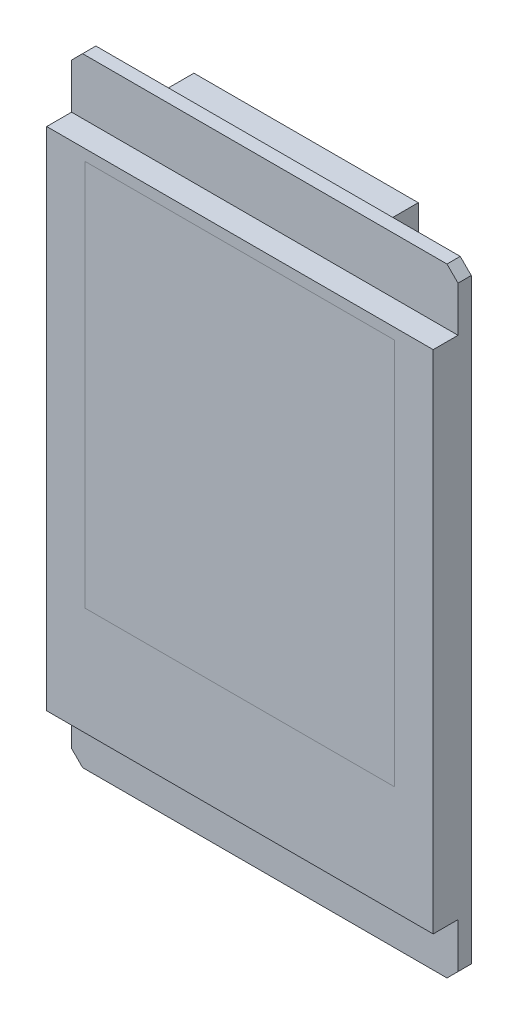
ISO-10303-21;
HEADER;
FILE_DESCRIPTION(('STEP AP214'),'2;1');
FILE_NAME('part.step','',(''),(''),'','','');
FILE_SCHEMA(('AUTOMOTIVE_DESIGN { 1 0 10303 214 1 1 1 1 }'));
ENDSEC;
DATA;
#1=APPLICATION_CONTEXT('core data for automotive mechanical design processes');
#2=APPLICATION_PROTOCOL_DEFINITION('international standard','automotive_design',2000,#1);
#3=PRODUCT_CONTEXT('',#1,'mechanical');
#4=PRODUCT('Part','Part','',(#3));
#5=PRODUCT_RELATED_PRODUCT_CATEGORY('part','',(#4));
#6=PRODUCT_DEFINITION_FORMATION('','',#4);
#7=PRODUCT_DEFINITION_CONTEXT('part definition',#1,'design');
#8=PRODUCT_DEFINITION('design','',#6,#7);
#9=PRODUCT_DEFINITION_SHAPE('','',#8);
#10=(LENGTH_UNIT() NAMED_UNIT(*) SI_UNIT(.MILLI.,.METRE.));
#11=(NAMED_UNIT(*) PLANE_ANGLE_UNIT() SI_UNIT($,.RADIAN.));
#12=(NAMED_UNIT(*) SI_UNIT($,.STERADIAN.) SOLID_ANGLE_UNIT());
#13=UNCERTAINTY_MEASURE_WITH_UNIT(LENGTH_MEASURE(1.E-05),#10,'distance_accuracy_value','');
#14=(GEOMETRIC_REPRESENTATION_CONTEXT(3) GLOBAL_UNCERTAINTY_ASSIGNED_CONTEXT((#13)) GLOBAL_UNIT_ASSIGNED_CONTEXT((#10,
#11,#12)) REPRESENTATION_CONTEXT('',''));
#15=CARTESIAN_POINT('',(0.,0.,0.));
#16=DIRECTION('',(0.,0.,1.));
#17=DIRECTION('',(1.,0.,0.));
#18=AXIS2_PLACEMENT_3D('',#15,#16,#17);
#19=CARTESIAN_POINT('',(0.,0.,0.));
#20=DIRECTION('',(0.,0.,-1.));
#21=DIRECTION('',(-1.,0.,0.));
#22=AXIS2_PLACEMENT_3D('',#19,#20,#21);
#23=PLANE('',#22);
#24=DIRECTION('',(0.,-1.,0.));
#25=VECTOR('',#24,1.);
#26=CARTESIAN_POINT('',(0.,1.,0.));
#27=LINE('',#26,#25);
#28=CARTESIAN_POINT('',(0.,55.,0.));
#29=VERTEX_POINT('',#28);
#30=CARTESIAN_POINT('',(0.,1.,0.));
#31=VERTEX_POINT('',#30);
#32=EDGE_CURVE('E497',#29,#31,#27,.T.);
#33=ORIENTED_EDGE('',*,*,#32,.F.);
#34=DIRECTION('',(-0.707106781186547,-0.707106781186548,0.));
#35=VECTOR('',#34,1.);
#36=CARTESIAN_POINT('',(0.,55.,0.));
#37=LINE('',#36,#35);
#38=CARTESIAN_POINT('',(1.,56.,0.));
#39=VERTEX_POINT('',#38);
#40=EDGE_CURVE('E546',#39,#29,#37,.T.);
#41=ORIENTED_EDGE('',*,*,#40,.F.);
#42=DIRECTION('',(-1.,0.,0.));
#43=VECTOR('',#42,1.);
#44=CARTESIAN_POINT('',(1.,56.,0.));
#45=LINE('',#44,#43);
#46=CARTESIAN_POINT('',(34.,56.,0.));
#47=VERTEX_POINT('',#46);
#48=EDGE_CURVE('E543',#47,#39,#45,.T.);
#49=ORIENTED_EDGE('',*,*,#48,.F.);
#50=DIRECTION('',(-0.707106781186547,0.707106781186547,0.));
#51=VECTOR('',#50,1.);
#52=CARTESIAN_POINT('',(34.,56.,0.));
#53=LINE('',#52,#51);
#54=CARTESIAN_POINT('',(35.,55.,0.));
#55=VERTEX_POINT('',#54);
#56=EDGE_CURVE('E540',#55,#47,#53,.T.);
#57=ORIENTED_EDGE('',*,*,#56,.F.);
#58=DIRECTION('',(0.,1.,0.));
#59=VECTOR('',#58,1.);
#60=CARTESIAN_POINT('',(35.,1.,0.));
#61=LINE('',#60,#59);
#62=CARTESIAN_POINT('',(35.,1.,0.));
#63=VERTEX_POINT('',#62);
#64=EDGE_CURVE('E537',#63,#55,#61,.T.);
#65=ORIENTED_EDGE('',*,*,#64,.F.);
#66=DIRECTION('',(0.707106781186548,0.707106781186547,0.));
#67=VECTOR('',#66,1.);
#68=CARTESIAN_POINT('',(34.,0.,0.));
#69=LINE('',#68,#67);
#70=CARTESIAN_POINT('',(34.,0.,0.));
#71=VERTEX_POINT('',#70);
#72=EDGE_CURVE('E534',#71,#63,#69,.T.);
#73=ORIENTED_EDGE('',*,*,#72,.F.);
#74=DIRECTION('',(1.,0.,0.));
#75=VECTOR('',#74,1.);
#76=CARTESIAN_POINT('',(1.,0.,0.));
#77=LINE('',#76,#75);
#78=CARTESIAN_POINT('',(1.,0.,0.));
#79=VERTEX_POINT('',#78);
#80=EDGE_CURVE('E531',#79,#71,#77,.T.);
#81=ORIENTED_EDGE('',*,*,#80,.F.);
#82=DIRECTION('',(0.707106781186548,-0.707106781186548,0.));
#83=VECTOR('',#82,1.);
#84=CARTESIAN_POINT('',(0.,1.,0.));
#85=LINE('',#84,#83);
#86=EDGE_CURVE('E528',#31,#79,#85,.T.);
#87=ORIENTED_EDGE('',*,*,#86,.F.);
#88=EDGE_LOOP('',(#33,#41,#49,#57,#65,#73,#81,#87));
#89=FACE_BOUND('',#88,.T.);
#90=DIRECTION('',(-1.,0.,0.));
#91=VECTOR('',#90,1.);
#92=CARTESIAN_POINT('',(27.66,53.23,0.));
#93=LINE('',#92,#91);
#94=CARTESIAN_POINT('',(27.66,53.23,0.));
#95=VERTEX_POINT('',#94);
#96=CARTESIAN_POINT('',(7.34,53.23,0.));
#97=VERTEX_POINT('',#96);
#98=EDGE_CURVE('E805',#95,#97,#93,.T.);
#99=ORIENTED_EDGE('',*,*,#98,.F.);
#100=DIRECTION('',(0.,-1.,0.));
#101=VECTOR('',#100,1.);
#102=CARTESIAN_POINT('',(27.66,53.23,0.));
#103=LINE('',#102,#101);
#104=CARTESIAN_POINT('',(27.66,55.77,0.));
#105=VERTEX_POINT('',#104);
#106=EDGE_CURVE('E452',#105,#95,#103,.T.);
#107=ORIENTED_EDGE('',*,*,#106,.F.);
#108=DIRECTION('',(1.,0.,0.));
#109=VECTOR('',#108,1.);
#110=CARTESIAN_POINT('',(27.66,55.77,0.));
#111=LINE('',#110,#109);
#112=CARTESIAN_POINT('',(7.34,55.77,0.));
#113=VERTEX_POINT('',#112);
#114=EDGE_CURVE('E448',#113,#105,#111,.T.);
#115=ORIENTED_EDGE('',*,*,#114,.F.);
#116=DIRECTION('',(0.,1.,0.));
#117=VECTOR('',#116,1.);
#118=CARTESIAN_POINT('',(7.34,53.23,0.));
#119=LINE('',#118,#117);
#120=EDGE_CURVE('E801',#97,#113,#119,.T.);
#121=ORIENTED_EDGE('',*,*,#120,.F.);
#122=EDGE_LOOP('',(#99,#107,#115,#121));
#123=FACE_BOUND('',#122,.T.);
#124=ADVANCED_FACE('F300',(#89,#123),#23,.T.);
#125=CARTESIAN_POINT('',(0.,0.,3.45));
#126=DIRECTION('',(0.,0.,-1.));
#127=DIRECTION('',(-1.,0.,0.));
#128=AXIS2_PLACEMENT_3D('',#125,#126,#127);
#129=PLANE('',#128);
#130=DIRECTION('',(0.,-1.,0.));
#131=VECTOR('',#130,1.);
#132=CARTESIAN_POINT('',(0.,5.08000000000001,3.45));
#133=LINE('',#132,#131);
#134=CARTESIAN_POINT('',(0.,50.91,3.45));
#135=VERTEX_POINT('',#134);
#136=CARTESIAN_POINT('',(0.,5.08000000000001,3.45));
#137=VERTEX_POINT('',#136);
#138=EDGE_CURVE('E465',#135,#137,#133,.T.);
#139=ORIENTED_EDGE('',*,*,#138,.T.);
#140=DIRECTION('',(1.,0.,0.));
#141=VECTOR('',#140,1.);
#142=CARTESIAN_POINT('',(0.,5.08000000000001,3.45));
#143=LINE('',#142,#141);
#144=CARTESIAN_POINT('',(35.,5.08000000000001,3.45));
#145=VERTEX_POINT('',#144);
#146=EDGE_CURVE('E469',#137,#145,#143,.T.);
#147=ORIENTED_EDGE('',*,*,#146,.T.);
#148=DIRECTION('',(0.,1.,0.));
#149=VECTOR('',#148,1.);
#150=CARTESIAN_POINT('',(35.,5.08000000000001,3.45));
#151=LINE('',#150,#149);
#152=CARTESIAN_POINT('',(35.,50.91,3.45));
#153=VERTEX_POINT('',#152);
#154=EDGE_CURVE('E472',#145,#153,#151,.T.);
#155=ORIENTED_EDGE('',*,*,#154,.T.);
#156=DIRECTION('',(-1.,0.,0.));
#157=VECTOR('',#156,1.);
#158=CARTESIAN_POINT('',(0.,50.91,3.45));
#159=LINE('',#158,#157);
#160=EDGE_CURVE('E475',#153,#135,#159,.T.);
#161=ORIENTED_EDGE('',*,*,#160,.T.);
#162=EDGE_LOOP('',(#139,#147,#155,#161));
#163=FACE_BOUND('',#162,.T.);
#164=CARTESIAN_POINT('',(3.48500000000259,14.8699999999974,3.45));
#165=CARTESIAN_POINT('',(3.48500000000252,15.272758620687,3.45));
#166=CARTESIAN_POINT('',(3.48500000000236,16.0782758620664,3.45));
#167=CARTESIAN_POINT('',(3.48500000000216,17.2865517241354,3.45));
#168=CARTESIAN_POINT('',(3.48500000000195,18.4948275862045,3.45));
#169=CARTESIAN_POINT('',(3.48500000000178,19.7031034482735,3.45));
#170=CARTESIAN_POINT('',(3.48500000000159,20.9113793103426,3.45));
#171=CARTESIAN_POINT('',(3.48500000000144,22.1196551724116,3.45));
#172=CARTESIAN_POINT('',(3.48500000000128,23.3279310344807,3.45));
#173=CARTESIAN_POINT('',(3.48500000000115,24.5362068965497,3.45));
#174=CARTESIAN_POINT('',(3.48500000000101,25.7444827586188,3.45));
#175=CARTESIAN_POINT('',(3.48500000000089,26.9527586206879,3.45));
#176=CARTESIAN_POINT('',(3.48500000000078,28.161034482757,3.45));
#177=CARTESIAN_POINT('',(3.48500000000067,29.369310344826,3.45));
#178=CARTESIAN_POINT('',(3.48500000000056,30.5775862068951,3.45));
#179=CARTESIAN_POINT('',(3.48500000000048,31.7858620689642,3.45));
#180=CARTESIAN_POINT('',(3.48500000000037,32.9941379310333,3.45));
#181=CARTESIAN_POINT('',(3.48500000000029,34.2024137931024,3.45));
#182=CARTESIAN_POINT('',(3.4850000000002,35.4106896551715,3.45));
#183=CARTESIAN_POINT('',(3.48500000000013,36.6189655172405,3.45));
#184=CARTESIAN_POINT('',(3.48500000000005,37.8272413793096,3.45));
#185=CARTESIAN_POINT('',(3.485,39.0355172413787,3.45));
#186=CARTESIAN_POINT('',(3.48499999999995,40.2437931034478,3.45));
#187=CARTESIAN_POINT('',(3.48499999999992,41.4520689655169,3.45));
#188=CARTESIAN_POINT('',(3.4849999999999,42.6603448275859,3.45));
#189=CARTESIAN_POINT('',(3.4849999999999,43.868620689655,3.45));
#190=CARTESIAN_POINT('',(3.48499999999991,45.0768965517241,3.45));
#191=CARTESIAN_POINT('',(3.48499999999993,46.2851724137931,3.45));
#192=CARTESIAN_POINT('',(3.48499999999992,47.4934482758621,3.45));
#193=CARTESIAN_POINT('',(3.48499999999993,48.7017241379311,3.45));
#194=CARTESIAN_POINT('',(3.48499999999991,49.5072413793104,3.45));
#195=CARTESIAN_POINT('',(3.4849999999999,49.9100000000001,3.45));
#196=B_SPLINE_CURVE_WITH_KNOTS('',3,(#164,#165,#166,#167,#168,#169,#170,#171,#172,#173,#174,
#175,#176,#177,#178,#179,#180,#181,#182,#183,#184,#185,#186,#187,#188,#189,#190,#191,#192,#193,
#194,#195),.UNSPECIFIED.,.F.,.F.,(4,1,1,1,1,1,1,1,1,1,1,1,1,1,1,1,1,1,1,1,1,1,1,1,1,1,1,1,1,4),
(0.,0.0344827586206888,0.0689655172413775,0.103448275862067,0.137931034482756,0.172413793103445,
0.206896551724135,0.241379310344825,0.275862068965515,0.310344827586205,0.344827586206894,
0.379310344827584,0.413793103448275,0.448275862068965,0.482758620689655,0.517241379310346,
0.551724137931036,0.586206896551726,0.620689655172416,0.655172413793107,0.689655172413798,
0.724137931034489,0.758620689655178,0.793103448275869,0.827586206896559,0.862068965517248,
0.896551724137936,0.931034482758625,0.965517241379313,1.),.UNSPECIFIED.);
#197=CARTESIAN_POINT('',(3.48500000000259,14.8699999999974,3.45));
#198=VERTEX_POINT('',#197);
#199=CARTESIAN_POINT('',(3.4849999999999,49.9100000000001,3.45));
#200=VERTEX_POINT('',#199);
#201=EDGE_CURVE('E580',#198,#200,#196,.T.);
#202=ORIENTED_EDGE('',*,*,#201,.T.);
#203=CARTESIAN_POINT('',(3.4849999999999,49.9100000000001,3.45));
#204=CARTESIAN_POINT('',(3.89123188405791,49.9100000000001,3.45));
#205=CARTESIAN_POINT('',(4.70369565217394,49.9100000000002,3.45));
#206=CARTESIAN_POINT('',(5.92239130434801,49.9100000000004,3.45));
#207=CARTESIAN_POINT('',(7.14108695652209,49.9100000000004,3.45));
#208=CARTESIAN_POINT('',(8.35978260869619,49.9100000000006,3.45));
#209=CARTESIAN_POINT('',(9.57847826087031,49.9100000000006,3.45));
#210=CARTESIAN_POINT('',(10.7971739130444,49.9100000000006,3.45));
#211=CARTESIAN_POINT('',(12.0158695652186,49.9100000000007,3.45));
#212=CARTESIAN_POINT('',(13.2345652173927,49.9100000000006,3.45));
#213=CARTESIAN_POINT('',(14.4532608695669,49.9100000000006,3.45));
#214=CARTESIAN_POINT('',(15.6719565217411,49.9100000000005,3.45));
#215=CARTESIAN_POINT('',(16.8906521739152,49.9100000000004,3.45));
#216=CARTESIAN_POINT('',(18.1093478260894,49.9100000000003,3.45));
#217=CARTESIAN_POINT('',(19.3280434782635,49.9100000000001,3.45));
#218=CARTESIAN_POINT('',(20.5467391304377,49.9099999999999,3.45));
#219=CARTESIAN_POINT('',(21.7654347826118,49.9099999999996,3.45));
#220=CARTESIAN_POINT('',(22.9841304347859,49.9099999999993,3.45));
#221=CARTESIAN_POINT('',(24.20282608696,49.9099999999991,3.45));
#222=CARTESIAN_POINT('',(25.4215217391341,49.9099999999987,3.45));
#223=CARTESIAN_POINT('',(26.6402173913082,49.9099999999983,3.45));
#224=CARTESIAN_POINT('',(27.8589130434822,49.909999999998,3.45));
#225=CARTESIAN_POINT('',(29.0776086956563,49.9099999999976,3.45));
#226=CARTESIAN_POINT('',(30.2963043478303,49.9099999999972,3.45));
#227=CARTESIAN_POINT('',(31.1087681159463,49.9099999999968,3.45));
#228=CARTESIAN_POINT('',(31.5150000000043,49.9099999999967,3.45));
#229=B_SPLINE_CURVE_WITH_KNOTS('',3,(#203,#204,#205,#206,#207,#208,#209,#210,#211,#212,#213,
#214,#215,#216,#217,#218,#219,#220,#221,#222,#223,#224,#225,#226,#227,#228),.UNSPECIFIED.,.F.,
.F.,(4,1,1,1,1,1,1,1,1,1,1,1,1,1,1,1,1,1,1,1,1,1,1,4),(0.,0.0434782608695627,0.0869565217391264,
0.130434782608691,0.173913043478256,0.217391304347822,0.260869565217389,0.304347826086955,
0.347826086956522,0.391304347826089,0.434782608695657,0.478260869565223,0.521739130434791,
0.565217391304357,0.608695652173924,0.65217391304349,0.695652173913056,0.739130434782621,
0.782608695652186,0.82608695652175,0.869565217391313,0.913043478260876,0.956521739130438,1.),.UNSPECIFIED.);
#230=CARTESIAN_POINT('',(31.5150000000043,49.9099999999967,3.45));
#231=VERTEX_POINT('',#230);
#232=EDGE_CURVE('E13',#200,#231,#229,.T.);
#233=ORIENTED_EDGE('',*,*,#232,.T.);
#234=CARTESIAN_POINT('',(31.5150000000043,49.9099999999967,3.45));
#235=CARTESIAN_POINT('',(31.5150000000041,49.507241379307,3.45));
#236=CARTESIAN_POINT('',(31.5150000000038,48.7017241379278,3.45));
#237=CARTESIAN_POINT('',(31.5150000000033,47.4934482758589,3.45));
#238=CARTESIAN_POINT('',(31.5150000000028,46.28517241379,3.45));
#239=CARTESIAN_POINT('',(31.5150000000024,45.0768965517211,3.45));
#240=CARTESIAN_POINT('',(31.515000000002,43.8686206896523,3.45));
#241=CARTESIAN_POINT('',(31.5150000000016,42.6603448275834,3.45));
#242=CARTESIAN_POINT('',(31.5150000000012,41.4520689655146,3.45));
#243=CARTESIAN_POINT('',(31.5150000000009,40.2437931034458,3.45));
#244=CARTESIAN_POINT('',(31.5150000000006,39.035517241377,3.45));
#245=CARTESIAN_POINT('',(31.5150000000004,37.8272413793082,3.45));
#246=CARTESIAN_POINT('',(31.5150000000001,36.6189655172394,3.45));
#247=CARTESIAN_POINT('',(31.5149999999999,35.4106896551707,3.45));
#248=CARTESIAN_POINT('',(31.5149999999997,34.2024137931019,3.45));
#249=CARTESIAN_POINT('',(31.5149999999995,32.9941379310331,3.45));
#250=CARTESIAN_POINT('',(31.5149999999995,31.7858620689644,3.45));
#251=CARTESIAN_POINT('',(31.5149999999994,30.5775862068956,3.45));
#252=CARTESIAN_POINT('',(31.5149999999994,29.3693103448268,3.45));
#253=CARTESIAN_POINT('',(31.5149999999995,28.1610344827581,3.45));
#254=CARTESIAN_POINT('',(31.5149999999996,26.9527586206893,3.45));
#255=CARTESIAN_POINT('',(31.5149999999996,25.7444827586205,3.45));
#256=CARTESIAN_POINT('',(31.5149999999998,24.5362068965518,3.45));
#257=CARTESIAN_POINT('',(31.5149999999999,23.327931034483,3.45));
#258=CARTESIAN_POINT('',(31.5150000000001,22.1196551724142,3.45));
#259=CARTESIAN_POINT('',(31.5150000000003,20.9113793103454,3.45));
#260=CARTESIAN_POINT('',(31.5150000000005,19.7031034482766,3.45));
#261=CARTESIAN_POINT('',(31.5150000000007,18.4948275862078,3.45));
#262=CARTESIAN_POINT('',(31.5150000000009,17.2865517241389,3.45));
#263=CARTESIAN_POINT('',(31.5150000000012,16.0782758620701,3.45));
#264=CARTESIAN_POINT('',(31.5150000000013,15.2727586206908,3.45));
#265=CARTESIAN_POINT('',(31.5150000000014,14.8700000000012,3.45));
#266=B_SPLINE_CURVE_WITH_KNOTS('',3,(#234,#235,#236,#237,#238,#239,#240,#241,#242,#243,#244,
#245,#246,#247,#248,#249,#250,#251,#252,#253,#254,#255,#256,#257,#258,#259,#260,#261,#262,#263,
#264,#265),.UNSPECIFIED.,.F.,.F.,(4,1,1,1,1,1,1,1,1,1,1,1,1,1,1,1,1,1,1,1,1,1,1,1,1,1,1,1,1,4),
(0.,0.0344827586206931,0.0689655172413857,0.103448275862078,0.137931034482769,0.17241379310346,
0.20689655172415,0.24137931034484,0.27586206896553,0.310344827586219,0.344827586206908,
0.379310344827596,0.413793103448285,0.448275862068973,0.482758620689662,0.51724137931035,
0.551724137931039,0.586206896551727,0.620689655172415,0.655172413793103,0.689655172413792,
0.724137931034481,0.758620689655169,0.793103448275859,0.827586206896548,0.862068965517238,
0.896551724137928,0.931034482758618,0.965517241379309,1.),.UNSPECIFIED.);
#267=CARTESIAN_POINT('',(31.5150000000014,14.8700000000012,3.45));
#268=VERTEX_POINT('',#267);
#269=EDGE_CURVE('E312',#231,#268,#266,.T.);
#270=ORIENTED_EDGE('',*,*,#269,.T.);
#271=CARTESIAN_POINT('',(31.5150000000014,14.8700000000012,3.45));
#272=CARTESIAN_POINT('',(31.1087681159434,14.8700000000012,3.45));
#273=CARTESIAN_POINT('',(30.2963043478275,14.8700000000011,3.45));
#274=CARTESIAN_POINT('',(29.0776086956536,14.8700000000009,3.45));
#275=CARTESIAN_POINT('',(27.8589130434797,14.8700000000008,3.45));
#276=CARTESIAN_POINT('',(26.6402173913059,14.8700000000007,3.45));
#277=CARTESIAN_POINT('',(25.421521739132,14.8700000000006,3.45));
#278=CARTESIAN_POINT('',(24.2028260869581,14.8700000000004,3.45));
#279=CARTESIAN_POINT('',(22.9841304347843,14.8700000000003,3.45));
#280=CARTESIAN_POINT('',(21.7654347826104,14.8700000000002,3.45));
#281=CARTESIAN_POINT('',(20.5467391304365,14.87,3.45));
#282=CARTESIAN_POINT('',(19.3280434782627,14.8699999999999,3.45));
#283=CARTESIAN_POINT('',(18.1093478260889,14.8699999999997,3.45));
#284=CARTESIAN_POINT('',(16.890652173915,14.8699999999996,3.45));
#285=CARTESIAN_POINT('',(15.6719565217412,14.8699999999994,3.45));
#286=CARTESIAN_POINT('',(14.4532608695673,14.8699999999992,3.45));
#287=CARTESIAN_POINT('',(13.2345652173935,14.869999999999,3.45));
#288=CARTESIAN_POINT('',(12.0158695652196,14.8699999999988,3.45));
#289=CARTESIAN_POINT('',(10.7971739130458,14.8699999999986,3.45));
#290=CARTESIAN_POINT('',(9.57847826087194,14.8699999999984,3.45));
#291=CARTESIAN_POINT('',(8.35978260869808,14.8699999999983,3.45));
#292=CARTESIAN_POINT('',(7.14108695652422,14.869999999998,3.45));
#293=CARTESIAN_POINT('',(5.92239130435035,14.8699999999978,3.45));
#294=CARTESIAN_POINT('',(4.70369565217647,14.8699999999976,3.45));
#295=CARTESIAN_POINT('',(3.89123188406055,14.8699999999974,3.45));
#296=CARTESIAN_POINT('',(3.48500000000259,14.8699999999974,3.45));
#297=B_SPLINE_CURVE_WITH_KNOTS('',3,(#271,#272,#273,#274,#275,#276,#277,#278,#279,#280,#281,
#282,#283,#284,#285,#286,#287,#288,#289,#290,#291,#292,#293,#294,#295,#296),.UNSPECIFIED.,.F.,
.F.,(4,1,1,1,1,1,1,1,1,1,1,1,1,1,1,1,1,1,1,1,1,1,1,4),(0.,0.0434782608695667,0.086956521739133,
0.130434782608699,0.173913043478264,0.21739130434783,0.260869565217396,0.304347826086961,
0.347826086956526,0.391304347826091,0.434782608695655,0.47826086956522,0.521739130434785,
0.565217391304349,0.608695652173914,0.652173913043478,0.695652173913043,0.739130434782608,
0.782608695652172,0.826086956521737,0.869565217391303,0.913043478260868,0.956521739130434,1.),.UNSPECIFIED.);
#298=EDGE_CURVE('E583',#268,#198,#297,.T.);
#299=ORIENTED_EDGE('',*,*,#298,.T.);
#300=EDGE_LOOP('',(#202,#233,#270,#299));
#301=FACE_BOUND('',#300,.T.);
#302=ADVANCED_FACE('F609',(#163,#301),#129,.F.);
#303=CARTESIAN_POINT('',(0.,0.,1.2));
#304=DIRECTION('',(0.,0.,-1.));
#305=DIRECTION('',(-1.,0.,0.));
#306=AXIS2_PLACEMENT_3D('',#303,#304,#305);
#307=PLANE('',#306);
#308=DIRECTION('',(-1.,0.,0.));
#309=VECTOR('',#308,1.);
#310=CARTESIAN_POINT('',(0.,50.91,1.2));
#311=LINE('',#310,#309);
#312=CARTESIAN_POINT('',(35.,50.91,1.2));
#313=VERTEX_POINT('',#312);
#314=CARTESIAN_POINT('',(0.,50.91,1.2));
#315=VERTEX_POINT('',#314);
#316=EDGE_CURVE('E460',#313,#315,#311,.T.);
#317=ORIENTED_EDGE('',*,*,#316,.F.);
#318=DIRECTION('',(0.,1.,0.));
#319=VECTOR('',#318,1.);
#320=CARTESIAN_POINT('',(35.,1.,1.2));
#321=LINE('',#320,#319);
#322=CARTESIAN_POINT('',(35.,55.,1.2));
#323=VERTEX_POINT('',#322);
#324=EDGE_CURVE('E511',#313,#323,#321,.T.);
#325=ORIENTED_EDGE('',*,*,#324,.T.);
#326=DIRECTION('',(-0.707106781186547,0.707106781186547,0.));
#327=VECTOR('',#326,1.);
#328=CARTESIAN_POINT('',(34.,56.,1.2));
#329=LINE('',#328,#327);
#330=CARTESIAN_POINT('',(34.,56.,1.2));
#331=VERTEX_POINT('',#330);
#332=EDGE_CURVE('E515',#323,#331,#329,.T.);
#333=ORIENTED_EDGE('',*,*,#332,.T.);
#334=DIRECTION('',(-1.,0.,0.));
#335=VECTOR('',#334,1.);
#336=CARTESIAN_POINT('',(1.,56.,1.2));
#337=LINE('',#336,#335);
#338=CARTESIAN_POINT('',(1.,56.,1.2));
#339=VERTEX_POINT('',#338);
#340=EDGE_CURVE('E518',#331,#339,#337,.T.);
#341=ORIENTED_EDGE('',*,*,#340,.T.);
#342=DIRECTION('',(-0.707106781186547,-0.707106781186548,0.));
#343=VECTOR('',#342,1.);
#344=CARTESIAN_POINT('',(0.,55.,1.2));
#345=LINE('',#344,#343);
#346=CARTESIAN_POINT('',(0.,55.,1.2));
#347=VERTEX_POINT('',#346);
#348=EDGE_CURVE('E521',#339,#347,#345,.T.);
#349=ORIENTED_EDGE('',*,*,#348,.T.);
#350=DIRECTION('',(0.,-1.,0.));
#351=VECTOR('',#350,1.);
#352=CARTESIAN_POINT('',(0.,1.,1.2));
#353=LINE('',#352,#351);
#354=EDGE_CURVE('E498',#347,#315,#353,.T.);
#355=ORIENTED_EDGE('',*,*,#354,.T.);
#356=EDGE_LOOP('',(#317,#325,#333,#341,#349,#355));
#357=FACE_BOUND('',#356,.T.);
#358=ADVANCED_FACE('F625',(#357),#307,.F.);
#359=DIRECTION('',(1.,0.,0.));
#360=VECTOR('',#359,1.);
#361=CARTESIAN_POINT('',(0.,5.08000000000001,1.2));
#362=LINE('',#361,#360);
#363=CARTESIAN_POINT('',(0.,5.08000000000001,1.2));
#364=VERTEX_POINT('',#363);
#365=CARTESIAN_POINT('',(35.,5.08000000000001,1.2));
#366=VERTEX_POINT('',#365);
#367=EDGE_CURVE('E455',#364,#366,#362,.T.);
#368=ORIENTED_EDGE('',*,*,#367,.F.);
#369=CARTESIAN_POINT('',(0.,1.,1.2));
#370=VERTEX_POINT('',#369);
#371=EDGE_CURVE('E502',#364,#370,#353,.T.);
#372=ORIENTED_EDGE('',*,*,#371,.T.);
#373=DIRECTION('',(0.707106781186548,-0.707106781186548,0.));
#374=VECTOR('',#373,1.);
#375=CARTESIAN_POINT('',(0.,1.,1.2));
#376=LINE('',#375,#374);
#377=CARTESIAN_POINT('',(1.,0.,1.2));
#378=VERTEX_POINT('',#377);
#379=EDGE_CURVE('E501',#370,#378,#376,.T.);
#380=ORIENTED_EDGE('',*,*,#379,.T.);
#381=DIRECTION('',(1.,0.,0.));
#382=VECTOR('',#381,1.);
#383=CARTESIAN_POINT('',(1.,0.,1.2));
#384=LINE('',#383,#382);
#385=CARTESIAN_POINT('',(34.,0.,1.2));
#386=VERTEX_POINT('',#385);
#387=EDGE_CURVE('E505',#378,#386,#384,.T.);
#388=ORIENTED_EDGE('',*,*,#387,.T.);
#389=DIRECTION('',(0.707106781186548,0.707106781186547,0.));
#390=VECTOR('',#389,1.);
#391=CARTESIAN_POINT('',(34.,0.,1.2));
#392=LINE('',#391,#390);
#393=CARTESIAN_POINT('',(35.,1.,1.2));
#394=VERTEX_POINT('',#393);
#395=EDGE_CURVE('E508',#386,#394,#392,.T.);
#396=ORIENTED_EDGE('',*,*,#395,.T.);
#397=EDGE_CURVE('E512',#394,#366,#321,.T.);
#398=ORIENTED_EDGE('',*,*,#397,.T.);
#399=EDGE_LOOP('',(#368,#372,#380,#388,#396,#398));
#400=FACE_BOUND('',#399,.T.);
#401=ADVANCED_FACE('F666',(#400),#307,.F.);
#402=CARTESIAN_POINT('',(0.,1.,1.2));
#403=DIRECTION('',(1.,0.,0.));
#404=DIRECTION('',(0.,0.,-1.));
#405=AXIS2_PLACEMENT_3D('',#402,#403,#404);
#406=PLANE('',#405);
#407=ORIENTED_EDGE('',*,*,#32,.T.);
#408=DIRECTION('',(0.,0.,-1.));
#409=VECTOR('',#408,1.);
#410=CARTESIAN_POINT('',(0.,1.,1.2));
#411=LINE('',#410,#409);
#412=EDGE_CURVE('E576',#370,#31,#411,.T.);
#413=ORIENTED_EDGE('',*,*,#412,.F.);
#414=ORIENTED_EDGE('',*,*,#371,.F.);
#415=DIRECTION('',(0.,0.,-1.));
#416=VECTOR('',#415,1.);
#417=CARTESIAN_POINT('',(0.,5.08000000000001,3.45));
#418=LINE('',#417,#416);
#419=EDGE_CURVE('E493',#137,#364,#418,.T.);
#420=ORIENTED_EDGE('',*,*,#419,.F.);
#421=ORIENTED_EDGE('',*,*,#138,.F.);
#422=DIRECTION('',(0.,0.,-1.));
#423=VECTOR('',#422,1.);
#424=CARTESIAN_POINT('',(0.,50.91,3.45));
#425=LINE('',#424,#423);
#426=EDGE_CURVE('E477',#135,#315,#425,.T.);
#427=ORIENTED_EDGE('',*,*,#426,.T.);
#428=ORIENTED_EDGE('',*,*,#354,.F.);
#429=DIRECTION('',(0.,0.,-1.));
#430=VECTOR('',#429,1.);
#431=CARTESIAN_POINT('',(0.,55.,1.2));
#432=LINE('',#431,#430);
#433=EDGE_CURVE('E524',#347,#29,#432,.T.);
#434=ORIENTED_EDGE('',*,*,#433,.T.);
#435=EDGE_LOOP('',(#407,#413,#414,#420,#421,#427,#428,#434));
#436=FACE_BOUND('',#435,.T.);
#437=ADVANCED_FACE('F302',(#436),#406,.F.);
#438=CARTESIAN_POINT('',(0.,1.,1.2));
#439=DIRECTION('',(0.707106781186548,0.707106781186548,0.));
#440=DIRECTION('',(-0.707106781186548,0.707106781186548,0.));
#441=AXIS2_PLACEMENT_3D('',#438,#439,#440);
#442=PLANE('',#441);
#443=ORIENTED_EDGE('',*,*,#86,.T.);
#444=DIRECTION('',(0.,0.,-1.));
#445=VECTOR('',#444,1.);
#446=CARTESIAN_POINT('',(1.,0.,1.2));
#447=LINE('',#446,#445);
#448=EDGE_CURVE('E572',#378,#79,#447,.T.);
#449=ORIENTED_EDGE('',*,*,#448,.F.);
#450=ORIENTED_EDGE('',*,*,#379,.F.);
#451=ORIENTED_EDGE('',*,*,#412,.T.);
#452=EDGE_LOOP('',(#443,#449,#450,#451));
#453=FACE_BOUND('',#452,.T.);
#454=ADVANCED_FACE('F659',(#453),#442,.F.);
#455=CARTESIAN_POINT('',(1.,0.,1.2));
#456=DIRECTION('',(0.,1.,0.));
#457=DIRECTION('',(0.,0.,1.));
#458=AXIS2_PLACEMENT_3D('',#455,#456,#457);
#459=PLANE('',#458);
#460=ORIENTED_EDGE('',*,*,#80,.T.);
#461=DIRECTION('',(0.,0.,-1.));
#462=VECTOR('',#461,1.);
#463=CARTESIAN_POINT('',(34.,0.,1.2));
#464=LINE('',#463,#462);
#465=EDGE_CURVE('E568',#386,#71,#464,.T.);
#466=ORIENTED_EDGE('',*,*,#465,.F.);
#467=ORIENTED_EDGE('',*,*,#387,.F.);
#468=ORIENTED_EDGE('',*,*,#448,.T.);
#469=EDGE_LOOP('',(#460,#466,#467,#468));
#470=FACE_BOUND('',#469,.T.);
#471=ADVANCED_FACE('F656',(#470),#459,.F.);
#472=CARTESIAN_POINT('',(34.,0.,1.2));
#473=DIRECTION('',(-0.707106781186547,0.707106781186548,0.));
#474=DIRECTION('',(-0.707106781186548,-0.707106781186547,0.));
#475=AXIS2_PLACEMENT_3D('',#472,#473,#474);
#476=PLANE('',#475);
#477=ORIENTED_EDGE('',*,*,#72,.T.);
#478=DIRECTION('',(0.,0.,-1.));
#479=VECTOR('',#478,1.);
#480=CARTESIAN_POINT('',(35.,1.,1.2));
#481=LINE('',#480,#479);
#482=EDGE_CURVE('E564',#394,#63,#481,.T.);
#483=ORIENTED_EDGE('',*,*,#482,.F.);
#484=ORIENTED_EDGE('',*,*,#395,.F.);
#485=ORIENTED_EDGE('',*,*,#465,.T.);
#486=EDGE_LOOP('',(#477,#483,#484,#485));
#487=FACE_BOUND('',#486,.T.);
#488=ADVANCED_FACE('F652',(#487),#476,.F.);
#489=CARTESIAN_POINT('',(35.,1.,1.2));
#490=DIRECTION('',(-1.,0.,0.));
#491=DIRECTION('',(0.,0.,1.));
#492=AXIS2_PLACEMENT_3D('',#489,#490,#491);
#493=PLANE('',#492);
#494=ORIENTED_EDGE('',*,*,#64,.T.);
#495=DIRECTION('',(0.,0.,-1.));
#496=VECTOR('',#495,1.);
#497=CARTESIAN_POINT('',(35.,55.,1.2));
#498=LINE('',#497,#496);
#499=EDGE_CURVE('E560',#323,#55,#498,.T.);
#500=ORIENTED_EDGE('',*,*,#499,.F.);
#501=ORIENTED_EDGE('',*,*,#324,.F.);
#502=DIRECTION('',(0.,0.,-1.));
#503=VECTOR('',#502,1.);
#504=CARTESIAN_POINT('',(35.,50.91,3.45));
#505=LINE('',#504,#503);
#506=EDGE_CURVE('E485',#153,#313,#505,.T.);
#507=ORIENTED_EDGE('',*,*,#506,.F.);
#508=ORIENTED_EDGE('',*,*,#154,.F.);
#509=DIRECTION('',(0.,0.,-1.));
#510=VECTOR('',#509,1.);
#511=CARTESIAN_POINT('',(35.,5.08000000000001,3.45));
#512=LINE('',#511,#510);
#513=EDGE_CURVE('E489',#145,#366,#512,.T.);
#514=ORIENTED_EDGE('',*,*,#513,.T.);
#515=ORIENTED_EDGE('',*,*,#397,.F.);
#516=ORIENTED_EDGE('',*,*,#482,.T.);
#517=EDGE_LOOP('',(#494,#500,#501,#507,#508,#514,#515,#516));
#518=FACE_BOUND('',#517,.T.);
#519=ADVANCED_FACE('F648',(#518),#493,.F.);
#520=CARTESIAN_POINT('',(34.,56.,1.2));
#521=DIRECTION('',(-0.707106781186547,-0.707106781186547,0.));
#522=DIRECTION('',(0.707106781186548,-0.707106781186548,0.));
#523=AXIS2_PLACEMENT_3D('',#520,#521,#522);
#524=PLANE('',#523);
#525=ORIENTED_EDGE('',*,*,#56,.T.);
#526=DIRECTION('',(0.,0.,-1.));
#527=VECTOR('',#526,1.);
#528=CARTESIAN_POINT('',(34.,56.,1.2));
#529=LINE('',#528,#527);
#530=EDGE_CURVE('E556',#331,#47,#529,.T.);
#531=ORIENTED_EDGE('',*,*,#530,.F.);
#532=ORIENTED_EDGE('',*,*,#332,.F.);
#533=ORIENTED_EDGE('',*,*,#499,.T.);
#534=EDGE_LOOP('',(#525,#531,#532,#533));
#535=FACE_BOUND('',#534,.T.);
#536=ADVANCED_FACE('F644',(#535),#524,.F.);
#537=CARTESIAN_POINT('',(1.,56.,1.2));
#538=DIRECTION('',(0.,-1.,0.));
#539=DIRECTION('',(0.,0.,-1.));
#540=AXIS2_PLACEMENT_3D('',#537,#538,#539);
#541=PLANE('',#540);
#542=ORIENTED_EDGE('',*,*,#48,.T.);
#543=DIRECTION('',(0.,0.,-1.));
#544=VECTOR('',#543,1.);
#545=CARTESIAN_POINT('',(1.,56.,1.2));
#546=LINE('',#545,#544);
#547=EDGE_CURVE('E552',#339,#39,#546,.T.);
#548=ORIENTED_EDGE('',*,*,#547,.F.);
#549=ORIENTED_EDGE('',*,*,#340,.F.);
#550=ORIENTED_EDGE('',*,*,#530,.T.);
#551=EDGE_LOOP('',(#542,#548,#549,#550));
#552=FACE_BOUND('',#551,.T.);
#553=ADVANCED_FACE('F640',(#552),#541,.F.);
#554=CARTESIAN_POINT('',(0.,55.,1.2));
#555=DIRECTION('',(0.707106781186548,-0.707106781186547,0.));
#556=DIRECTION('',(0.707106781186547,0.707106781186548,0.));
#557=AXIS2_PLACEMENT_3D('',#554,#555,#556);
#558=PLANE('',#557);
#559=ORIENTED_EDGE('',*,*,#40,.T.);
#560=ORIENTED_EDGE('',*,*,#433,.F.);
#561=ORIENTED_EDGE('',*,*,#348,.F.);
#562=ORIENTED_EDGE('',*,*,#547,.T.);
#563=EDGE_LOOP('',(#559,#560,#561,#562));
#564=FACE_BOUND('',#563,.T.);
#565=ADVANCED_FACE('F637',(#564),#558,.F.);
#566=CARTESIAN_POINT('',(0.,5.08000000000001,3.45));
#567=DIRECTION('',(0.,1.,0.));
#568=DIRECTION('',(0.,0.,1.));
#569=AXIS2_PLACEMENT_3D('',#566,#567,#568);
#570=PLANE('',#569);
#571=ORIENTED_EDGE('',*,*,#367,.T.);
#572=ORIENTED_EDGE('',*,*,#513,.F.);
#573=ORIENTED_EDGE('',*,*,#146,.F.);
#574=ORIENTED_EDGE('',*,*,#419,.T.);
#575=EDGE_LOOP('',(#571,#572,#573,#574));
#576=FACE_BOUND('',#575,.T.);
#577=ADVANCED_FACE('F621',(#576),#570,.F.);
#578=CARTESIAN_POINT('',(0.,50.91,3.45));
#579=DIRECTION('',(0.,-1.,0.));
#580=DIRECTION('',(0.,0.,-1.));
#581=AXIS2_PLACEMENT_3D('',#578,#579,#580);
#582=PLANE('',#581);
#583=ORIENTED_EDGE('',*,*,#316,.T.);
#584=ORIENTED_EDGE('',*,*,#426,.F.);
#585=ORIENTED_EDGE('',*,*,#160,.F.);
#586=ORIENTED_EDGE('',*,*,#506,.T.);
#587=EDGE_LOOP('',(#583,#584,#585,#586));
#588=FACE_BOUND('',#587,.T.);
#589=ADVANCED_FACE('F614',(#588),#582,.F.);
#590=ORIENTED_EDGE('',*,*,#232,.F.);
#591=ORIENTED_EDGE('',*,*,#201,.F.);
#592=ORIENTED_EDGE('',*,*,#298,.F.);
#593=ORIENTED_EDGE('',*,*,#269,.F.);
#594=EDGE_LOOP('',(#590,#591,#592,#593));
#595=FACE_BOUND('',#594,.T.);
#596=ADVANCED_FACE('F612',(#595),#129,.F.);
#597=CARTESIAN_POINT('',(27.66,53.23,-2.54));
#598=DIRECTION('',(-1.,0.,0.));
#599=DIRECTION('',(0.,0.,1.));
#600=AXIS2_PLACEMENT_3D('',#597,#598,#599);
#601=PLANE('',#600);
#602=ORIENTED_EDGE('',*,*,#106,.T.);
#603=DIRECTION('',(0.,0.,1.));
#604=VECTOR('',#603,1.);
#605=CARTESIAN_POINT('',(27.66,53.23,-2.54));
#606=LINE('',#605,#604);
#607=CARTESIAN_POINT('',(27.66,53.23,-2.54));
#608=VERTEX_POINT('',#607);
#609=EDGE_CURVE('E431',#608,#95,#606,.T.);
#610=ORIENTED_EDGE('',*,*,#609,.F.);
#611=DIRECTION('',(0.,-1.,0.));
#612=VECTOR('',#611,1.);
#613=CARTESIAN_POINT('',(27.66,53.23,-2.54));
#614=LINE('',#613,#612);
#615=CARTESIAN_POINT('',(27.66,55.77,-2.54));
#616=VERTEX_POINT('',#615);
#617=EDGE_CURVE('E439',#616,#608,#614,.T.);
#618=ORIENTED_EDGE('',*,*,#617,.F.);
#619=DIRECTION('',(0.,0.,1.));
#620=VECTOR('',#619,1.);
#621=CARTESIAN_POINT('',(27.66,55.77,-2.54));
#622=LINE('',#621,#620);
#623=EDGE_CURVE('E798',#616,#105,#622,.T.);
#624=ORIENTED_EDGE('',*,*,#623,.T.);
#625=EDGE_LOOP('',(#602,#610,#618,#624));
#626=FACE_BOUND('',#625,.T.);
#627=ADVANCED_FACE('F450',(#626),#601,.F.);
#628=CARTESIAN_POINT('',(27.66,53.23,-2.54));
#629=DIRECTION('',(0.,1.,0.));
#630=DIRECTION('',(0.,0.,1.));
#631=AXIS2_PLACEMENT_3D('',#628,#629,#630);
#632=PLANE('',#631);
#633=ORIENTED_EDGE('',*,*,#98,.T.);
#634=DIRECTION('',(0.,0.,1.));
#635=VECTOR('',#634,1.);
#636=CARTESIAN_POINT('',(7.34,53.23,-2.54));
#637=LINE('',#636,#635);
#638=CARTESIAN_POINT('',(7.34,53.23,-2.54));
#639=VERTEX_POINT('',#638);
#640=EDGE_CURVE('E434',#639,#97,#637,.T.);
#641=ORIENTED_EDGE('',*,*,#640,.F.);
#642=DIRECTION('',(-1.,0.,0.));
#643=VECTOR('',#642,1.);
#644=CARTESIAN_POINT('',(27.66,53.23,-2.54));
#645=LINE('',#644,#643);
#646=EDGE_CURVE('E427',#608,#639,#645,.T.);
#647=ORIENTED_EDGE('',*,*,#646,.F.);
#648=ORIENTED_EDGE('',*,*,#609,.T.);
#649=EDGE_LOOP('',(#633,#641,#647,#648));
#650=FACE_BOUND('',#649,.T.);
#651=ADVANCED_FACE('F429',(#650),#632,.F.);
#652=CARTESIAN_POINT('',(7.34,53.23,-2.54));
#653=DIRECTION('',(1.,0.,0.));
#654=DIRECTION('',(0.,0.,-1.));
#655=AXIS2_PLACEMENT_3D('',#652,#653,#654);
#656=PLANE('',#655);
#657=ORIENTED_EDGE('',*,*,#120,.T.);
#658=DIRECTION('',(0.,0.,1.));
#659=VECTOR('',#658,1.);
#660=CARTESIAN_POINT('',(7.34,55.77,-2.54));
#661=LINE('',#660,#659);
#662=CARTESIAN_POINT('',(7.34,55.77,-2.54));
#663=VERTEX_POINT('',#662);
#664=EDGE_CURVE('E319',#663,#113,#661,.T.);
#665=ORIENTED_EDGE('',*,*,#664,.F.);
#666=DIRECTION('',(0.,1.,0.));
#667=VECTOR('',#666,1.);
#668=CARTESIAN_POINT('',(7.34,53.23,-2.54));
#669=LINE('',#668,#667);
#670=EDGE_CURVE('E438',#639,#663,#669,.T.);
#671=ORIENTED_EDGE('',*,*,#670,.F.);
#672=ORIENTED_EDGE('',*,*,#640,.T.);
#673=EDGE_LOOP('',(#657,#665,#671,#672));
#674=FACE_BOUND('',#673,.T.);
#675=ADVANCED_FACE('F767',(#674),#656,.F.);
#676=CARTESIAN_POINT('',(27.66,55.77,-2.54));
#677=DIRECTION('',(0.,-1.,0.));
#678=DIRECTION('',(0.,0.,-1.));
#679=AXIS2_PLACEMENT_3D('',#676,#677,#678);
#680=PLANE('',#679);
#681=ORIENTED_EDGE('',*,*,#114,.T.);
#682=ORIENTED_EDGE('',*,*,#623,.F.);
#683=DIRECTION('',(1.,0.,0.));
#684=VECTOR('',#683,1.);
#685=CARTESIAN_POINT('',(27.66,55.77,-2.54));
#686=LINE('',#685,#684);
#687=EDGE_CURVE('E443',#663,#616,#686,.T.);
#688=ORIENTED_EDGE('',*,*,#687,.F.);
#689=ORIENTED_EDGE('',*,*,#664,.T.);
#690=EDGE_LOOP('',(#681,#682,#688,#689));
#691=FACE_BOUND('',#690,.T.);
#692=ADVANCED_FACE('F776',(#691),#680,.F.);
#693=CARTESIAN_POINT('',(0.,0.,-2.54));
#694=DIRECTION('',(0.,0.,1.));
#695=DIRECTION('',(1.,0.,0.));
#696=AXIS2_PLACEMENT_3D('',#693,#694,#695);
#697=PLANE('',#696);
#698=ORIENTED_EDGE('',*,*,#617,.T.);
#699=ORIENTED_EDGE('',*,*,#646,.T.);
#700=ORIENTED_EDGE('',*,*,#670,.T.);
#701=ORIENTED_EDGE('',*,*,#687,.T.);
#702=EDGE_LOOP('',(#698,#699,#700,#701));
#703=FACE_BOUND('',#702,.T.);
#704=ADVANCED_FACE('F442',(#703),#697,.F.);
#705=CLOSED_SHELL('',(#124,#302,#358,#401,#437,#454,#471,#488,#519,#536,#553,#565,#577,#589,
#596,#627,#651,#675,#692,#704));
#706=MANIFOLD_SOLID_BREP('B2',#705);
#707=ADVANCED_BREP_SHAPE_REPRESENTATION('',(#18,#706),#14);
#708=SHAPE_DEFINITION_REPRESENTATION(#9,#707);
ENDSEC;
END-ISO-10303-21;
